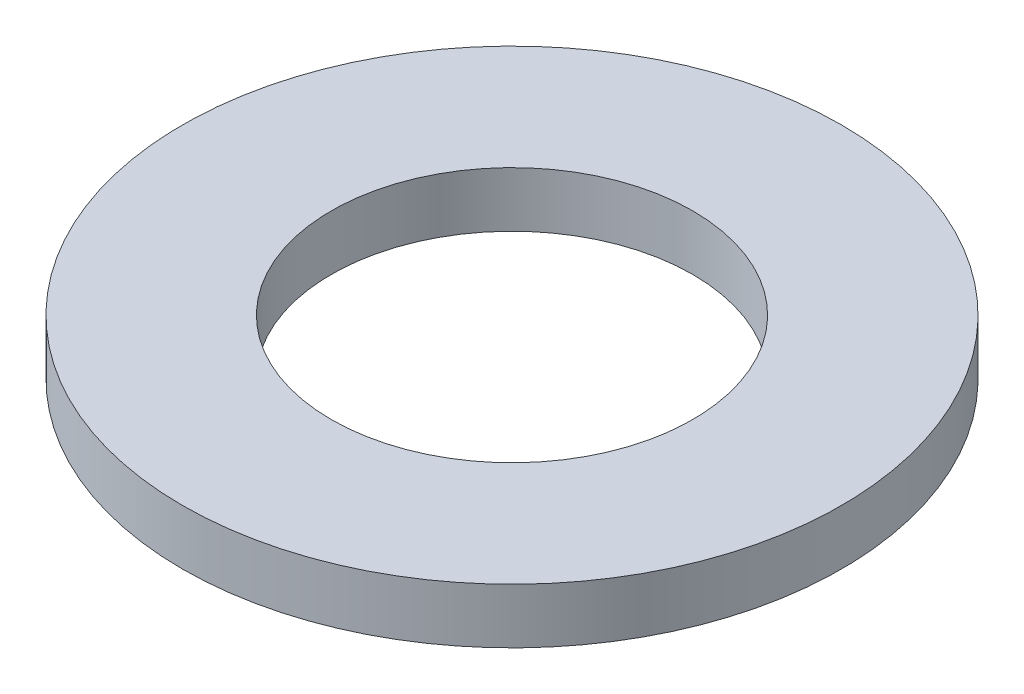
ISO-10303-21;
HEADER;
FILE_DESCRIPTION(('STEP AP214'),'2;1');
FILE_NAME('part.step','',(''),(''),'','','');
FILE_SCHEMA(('AUTOMOTIVE_DESIGN { 1 0 10303 214 1 1 1 1 }'));
ENDSEC;
DATA;
#1=APPLICATION_CONTEXT('core data for automotive mechanical design processes');
#2=APPLICATION_PROTOCOL_DEFINITION('international standard','automotive_design',2000,#1);
#3=PRODUCT_CONTEXT('',#1,'mechanical');
#4=PRODUCT('Part','Part','',(#3));
#5=PRODUCT_RELATED_PRODUCT_CATEGORY('part','',(#4));
#6=PRODUCT_DEFINITION_FORMATION('','',#4);
#7=PRODUCT_DEFINITION_CONTEXT('part definition',#1,'design');
#8=PRODUCT_DEFINITION('design','',#6,#7);
#9=PRODUCT_DEFINITION_SHAPE('','',#8);
#10=(LENGTH_UNIT() NAMED_UNIT(*) SI_UNIT(.MILLI.,.METRE.));
#11=(NAMED_UNIT(*) PLANE_ANGLE_UNIT() SI_UNIT($,.RADIAN.));
#12=(NAMED_UNIT(*) SI_UNIT($,.STERADIAN.) SOLID_ANGLE_UNIT());
#13=UNCERTAINTY_MEASURE_WITH_UNIT(LENGTH_MEASURE(1.E-05),#10,'distance_accuracy_value','');
#14=(GEOMETRIC_REPRESENTATION_CONTEXT(3) GLOBAL_UNCERTAINTY_ASSIGNED_CONTEXT((#13)) GLOBAL_UNIT_ASSIGNED_CONTEXT((#10,
#11,#12)) REPRESENTATION_CONTEXT('',''));
#15=CARTESIAN_POINT('',(0.,0.,0.));
#16=DIRECTION('',(0.,0.,1.));
#17=DIRECTION('',(1.,0.,0.));
#18=AXIS2_PLACEMENT_3D('',#15,#16,#17);
#19=CARTESIAN_POINT('',(0.,3.175,0.));
#20=DIRECTION('',(0.,1.,0.));
#21=DIRECTION('',(0.,0.,1.));
#22=AXIS2_PLACEMENT_3D('',#19,#20,#21);
#23=PLANE('',#22);
#24=CARTESIAN_POINT('',(0.,3.175,0.));
#25=DIRECTION('',(0.,1.,0.));
#26=DIRECTION('',(0.,0.,1.));
#27=AXIS2_PLACEMENT_3D('',#24,#25,#26);
#28=CIRCLE('',#27,37.973);
#29=CARTESIAN_POINT('',(0.,3.175,37.973));
#30=VERTEX_POINT('',#29);
#31=EDGE_CURVE('E10',#30,#30,#28,.T.);
#32=ORIENTED_EDGE('',*,*,#31,.T.);
#33=EDGE_LOOP('',(#32));
#34=FACE_BOUND('',#33,.T.);
#35=CARTESIAN_POINT('',(0.,3.175,0.));
#36=DIRECTION('',(0.,1.,0.));
#37=DIRECTION('',(0.,0.,1.));
#38=AXIS2_PLACEMENT_3D('',#35,#36,#37);
#39=CIRCLE('',#38,20.828);
#40=CARTESIAN_POINT('',(0.,3.175,20.828));
#41=VERTEX_POINT('',#40);
#42=EDGE_CURVE('E50',#41,#41,#39,.T.);
#43=ORIENTED_EDGE('',*,*,#42,.F.);
#44=EDGE_LOOP('',(#43));
#45=FACE_BOUND('',#44,.T.);
#46=ADVANCED_FACE('F37',(#34,#45),#23,.T.);
#47=CARTESIAN_POINT('',(0.,-3.175,0.));
#48=DIRECTION('',(0.,1.,0.));
#49=DIRECTION('',(0.,0.,1.));
#50=AXIS2_PLACEMENT_3D('',#47,#48,#49);
#51=PLANE('',#50);
#52=CARTESIAN_POINT('',(0.,-3.175,0.));
#53=DIRECTION('',(0.,1.,0.));
#54=DIRECTION('',(0.,0.,1.));
#55=AXIS2_PLACEMENT_3D('',#52,#53,#54);
#56=CIRCLE('',#55,37.973);
#57=CARTESIAN_POINT('',(0.,-3.175,37.973));
#58=VERTEX_POINT('',#57);
#59=EDGE_CURVE('E41',#58,#58,#56,.T.);
#60=ORIENTED_EDGE('',*,*,#59,.F.);
#61=EDGE_LOOP('',(#60));
#62=FACE_BOUND('',#61,.T.);
#63=CARTESIAN_POINT('',(0.,-3.175,0.));
#64=DIRECTION('',(0.,1.,0.));
#65=DIRECTION('',(0.,0.,1.));
#66=AXIS2_PLACEMENT_3D('',#63,#64,#65);
#67=CIRCLE('',#66,20.828);
#68=CARTESIAN_POINT('',(0.,-3.175,20.828));
#69=VERTEX_POINT('',#68);
#70=EDGE_CURVE('E52',#69,#69,#67,.T.);
#71=ORIENTED_EDGE('',*,*,#70,.T.);
#72=EDGE_LOOP('',(#71));
#73=FACE_BOUND('',#72,.T.);
#74=ADVANCED_FACE('F64',(#62,#73),#51,.F.);
#75=CARTESIAN_POINT('',(0.,3.175,0.));
#76=DIRECTION('',(0.,-1.,0.));
#77=DIRECTION('',(0.,0.,-1.));
#78=AXIS2_PLACEMENT_3D('',#75,#76,#77);
#79=CYLINDRICAL_SURFACE('',#78,37.973);
#80=ORIENTED_EDGE('',*,*,#31,.F.);
#81=EDGE_LOOP('',(#80));
#82=FACE_BOUND('',#81,.T.);
#83=ORIENTED_EDGE('',*,*,#59,.T.);
#84=EDGE_LOOP('',(#83));
#85=FACE_BOUND('',#84,.T.);
#86=ADVANCED_FACE('F39',(#82,#85),#79,.T.);
#87=CARTESIAN_POINT('',(0.,3.175,0.));
#88=DIRECTION('',(0.,-1.,0.));
#89=DIRECTION('',(0.,0.,-1.));
#90=AXIS2_PLACEMENT_3D('',#87,#88,#89);
#91=CYLINDRICAL_SURFACE('',#90,20.828);
#92=ORIENTED_EDGE('',*,*,#42,.T.);
#93=EDGE_LOOP('',(#92));
#94=FACE_BOUND('',#93,.T.);
#95=ORIENTED_EDGE('',*,*,#70,.F.);
#96=EDGE_LOOP('',(#95));
#97=FACE_BOUND('',#96,.T.);
#98=ADVANCED_FACE('F60',(#94,#97),#91,.F.);
#99=CLOSED_SHELL('',(#46,#74,#86,#98));
#100=MANIFOLD_SOLID_BREP('B2',#99);
#101=ADVANCED_BREP_SHAPE_REPRESENTATION('',(#18,#100),#14);
#102=SHAPE_DEFINITION_REPRESENTATION(#9,#101);
ENDSEC;
END-ISO-10303-21;
